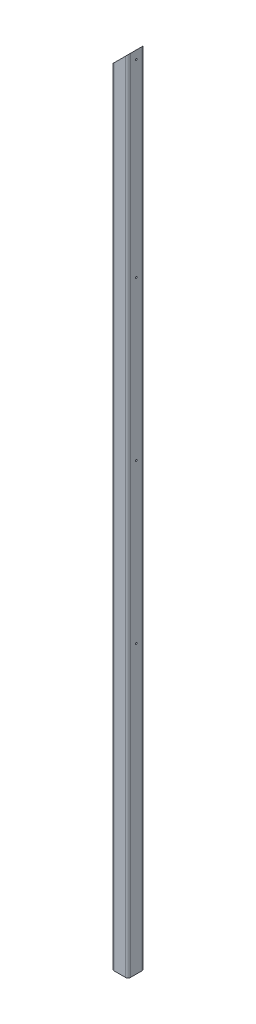
ISO-10303-21;
HEADER;
FILE_DESCRIPTION(('STEP AP214'),'2;1');
FILE_NAME('part.step','',(''),(''),'','','');
FILE_SCHEMA(('AUTOMOTIVE_DESIGN { 1 0 10303 214 1 1 1 1 }'));
ENDSEC;
DATA;
#1=APPLICATION_CONTEXT('core data for automotive mechanical design processes');
#2=APPLICATION_PROTOCOL_DEFINITION('international standard','automotive_design',2000,#1);
#3=PRODUCT_CONTEXT('',#1,'mechanical');
#4=PRODUCT('Part','Part','',(#3));
#5=PRODUCT_RELATED_PRODUCT_CATEGORY('part','',(#4));
#6=PRODUCT_DEFINITION_FORMATION('','',#4);
#7=PRODUCT_DEFINITION_CONTEXT('part definition',#1,'design');
#8=PRODUCT_DEFINITION('design','',#6,#7);
#9=PRODUCT_DEFINITION_SHAPE('','',#8);
#10=(LENGTH_UNIT() NAMED_UNIT(*) SI_UNIT(.MILLI.,.METRE.));
#11=(NAMED_UNIT(*) PLANE_ANGLE_UNIT() SI_UNIT($,.RADIAN.));
#12=(NAMED_UNIT(*) SI_UNIT($,.STERADIAN.) SOLID_ANGLE_UNIT());
#13=UNCERTAINTY_MEASURE_WITH_UNIT(LENGTH_MEASURE(1.E-05),#10,'distance_accuracy_value','');
#14=(GEOMETRIC_REPRESENTATION_CONTEXT(3) GLOBAL_UNCERTAINTY_ASSIGNED_CONTEXT((#13)) GLOBAL_UNIT_ASSIGNED_CONTEXT((#10,
#11,#12)) REPRESENTATION_CONTEXT('',''));
#15=CARTESIAN_POINT('',(0.,0.,0.));
#16=DIRECTION('',(0.,0.,1.));
#17=DIRECTION('',(1.,0.,0.));
#18=AXIS2_PLACEMENT_3D('',#15,#16,#17);
#19=CARTESIAN_POINT('',(-13.6,1920.,13.6));
#20=DIRECTION('',(0.,-1.,0.));
#21=DIRECTION('',(0.,0.,-1.));
#22=AXIS2_PLACEMENT_3D('',#19,#20,#21);
#23=CYLINDRICAL_SURFACE('',#22,6.4);
#24=CARTESIAN_POINT('',(-13.6,1886.4,13.6));
#25=DIRECTION('',(-0.707106781186548,0.707106781186547,0.));
#26=DIRECTION('',(-0.707106781186547,-0.707106781186548,0.));
#27=AXIS2_PLACEMENT_3D('',#24,#25,#26);
#28=ELLIPSE('',#27,9.05096679918782,6.4);
#29=CARTESIAN_POINT('',(-20.,1880.,13.6));
#30=VERTEX_POINT('',#29);
#31=CARTESIAN_POINT('',(-13.5999999999999,1886.4,20.));
#32=VERTEX_POINT('',#31);
#33=EDGE_CURVE('E245',#30,#32,#28,.T.);
#34=ORIENTED_EDGE('',*,*,#33,.F.);
#35=DIRECTION('',(0.,-1.,0.));
#36=VECTOR('',#35,1.);
#37=CARTESIAN_POINT('',(-20.,1920.,13.6));
#38=LINE('',#37,#36);
#39=CARTESIAN_POINT('',(-20.,0.,13.6));
#40=VERTEX_POINT('',#39);
#41=EDGE_CURVE('E161',#30,#40,#38,.T.);
#42=ORIENTED_EDGE('',*,*,#41,.T.);
#43=CARTESIAN_POINT('',(-13.6,0.,13.6));
#44=DIRECTION('',(0.,1.,0.));
#45=DIRECTION('',(0.,0.,1.));
#46=AXIS2_PLACEMENT_3D('',#43,#44,#45);
#47=CIRCLE('',#46,6.4);
#48=CARTESIAN_POINT('',(-13.6,0.,20.));
#49=VERTEX_POINT('',#48);
#50=EDGE_CURVE('E176',#40,#49,#47,.T.);
#51=ORIENTED_EDGE('',*,*,#50,.T.);
#52=DIRECTION('',(0.,-1.,0.));
#53=VECTOR('',#52,1.);
#54=CARTESIAN_POINT('',(-13.6,1920.,20.));
#55=LINE('',#54,#53);
#56=EDGE_CURVE('E12',#32,#49,#55,.T.);
#57=ORIENTED_EDGE('',*,*,#56,.F.);
#58=EDGE_LOOP('',(#34,#42,#51,#57));
#59=FACE_BOUND('',#58,.T.);
#60=ADVANCED_FACE('F66',(#59),#23,.T.);
#61=CARTESIAN_POINT('',(-13.6,1920.,20.));
#62=DIRECTION('',(0.,0.,-1.));
#63=DIRECTION('',(-1.,0.,0.));
#64=AXIS2_PLACEMENT_3D('',#61,#62,#63);
#65=PLANE('',#64);
#66=DIRECTION('',(0.707106781186547,0.707106781186548,0.));
#67=VECTOR('',#66,1.);
#68=CARTESIAN_POINT('',(-950.,950.,20.));
#69=LINE('',#68,#67);
#70=CARTESIAN_POINT('',(13.6,1913.6,20.));
#71=VERTEX_POINT('',#70);
#72=EDGE_CURVE('E350',#32,#71,#69,.T.);
#73=ORIENTED_EDGE('',*,*,#72,.F.);
#74=ORIENTED_EDGE('',*,*,#56,.T.);
#75=DIRECTION('',(1.,0.,0.));
#76=VECTOR('',#75,1.);
#77=CARTESIAN_POINT('',(-13.6,0.,20.));
#78=LINE('',#77,#76);
#79=CARTESIAN_POINT('',(13.6,0.,20.));
#80=VERTEX_POINT('',#79);
#81=EDGE_CURVE('E274',#49,#80,#78,.T.);
#82=ORIENTED_EDGE('',*,*,#81,.T.);
#83=DIRECTION('',(0.,-1.,0.));
#84=VECTOR('',#83,1.);
#85=CARTESIAN_POINT('',(13.6,1920.,20.));
#86=LINE('',#85,#84);
#87=EDGE_CURVE('E76',#71,#80,#86,.T.);
#88=ORIENTED_EDGE('',*,*,#87,.F.);
#89=EDGE_LOOP('',(#73,#74,#82,#88));
#90=FACE_BOUND('',#89,.T.);
#91=ADVANCED_FACE('F356',(#90),#65,.F.);
#92=CARTESIAN_POINT('',(13.6,1920.,13.6));
#93=DIRECTION('',(0.,-1.,0.));
#94=DIRECTION('',(0.,0.,-1.));
#95=AXIS2_PLACEMENT_3D('',#92,#93,#94);
#96=CYLINDRICAL_SURFACE('',#95,6.4);
#97=CARTESIAN_POINT('',(13.6,1913.6,13.6));
#98=DIRECTION('',(-0.707106781186548,0.707106781186547,0.));
#99=DIRECTION('',(-0.707106781186547,-0.707106781186548,0.));
#100=AXIS2_PLACEMENT_3D('',#97,#98,#99);
#101=ELLIPSE('',#100,9.05096679918782,6.4);
#102=CARTESIAN_POINT('',(20.,1920.,13.6));
#103=VERTEX_POINT('',#102);
#104=EDGE_CURVE('E93',#71,#103,#101,.T.);
#105=ORIENTED_EDGE('',*,*,#104,.F.);
#106=ORIENTED_EDGE('',*,*,#87,.T.);
#107=CARTESIAN_POINT('',(13.6,0.,13.6));
#108=DIRECTION('',(0.,1.,0.));
#109=DIRECTION('',(0.,0.,1.));
#110=AXIS2_PLACEMENT_3D('',#107,#108,#109);
#111=CIRCLE('',#110,6.4);
#112=CARTESIAN_POINT('',(20.,0.,13.6));
#113=VERTEX_POINT('',#112);
#114=EDGE_CURVE('E278',#80,#113,#111,.T.);
#115=ORIENTED_EDGE('',*,*,#114,.T.);
#116=DIRECTION('',(0.,-1.,0.));
#117=VECTOR('',#116,1.);
#118=CARTESIAN_POINT('',(20.,1920.,13.6));
#119=LINE('',#118,#117);
#120=EDGE_CURVE('E196',#103,#113,#119,.T.);
#121=ORIENTED_EDGE('',*,*,#120,.F.);
#122=EDGE_LOOP('',(#105,#106,#115,#121));
#123=FACE_BOUND('',#122,.T.);
#124=ADVANCED_FACE('F424',(#123),#96,.T.);
#125=CARTESIAN_POINT('',(13.6,1920.,-13.6));
#126=DIRECTION('',(0.,-1.,0.));
#127=DIRECTION('',(0.,0.,-1.));
#128=AXIS2_PLACEMENT_3D('',#125,#126,#127);
#129=CYLINDRICAL_SURFACE('',#128,6.4);
#130=CARTESIAN_POINT('',(13.6,1913.6,-13.6));
#131=DIRECTION('',(-0.707106781186548,0.707106781186547,0.));
#132=DIRECTION('',(-0.707106781186547,-0.707106781186548,0.));
#133=AXIS2_PLACEMENT_3D('',#130,#131,#132);
#134=ELLIPSE('',#133,9.05096679918781,6.4);
#135=CARTESIAN_POINT('',(20.,1920.,-13.6));
#136=VERTEX_POINT('',#135);
#137=CARTESIAN_POINT('',(13.6000000000003,1913.6,-20.));
#138=VERTEX_POINT('',#137);
#139=EDGE_CURVE('E303',#136,#138,#134,.T.);
#140=ORIENTED_EDGE('',*,*,#139,.F.);
#141=DIRECTION('',(0.,-1.,0.));
#142=VECTOR('',#141,1.);
#143=CARTESIAN_POINT('',(20.,1920.,-13.6));
#144=LINE('',#143,#142);
#145=CARTESIAN_POINT('',(20.,0.,-13.6));
#146=VERTEX_POINT('',#145);
#147=EDGE_CURVE('E192',#136,#146,#144,.T.);
#148=ORIENTED_EDGE('',*,*,#147,.T.);
#149=CARTESIAN_POINT('',(13.6,0.,-13.6));
#150=DIRECTION('',(0.,1.,0.));
#151=DIRECTION('',(0.,0.,1.));
#152=AXIS2_PLACEMENT_3D('',#149,#150,#151);
#153=CIRCLE('',#152,6.4);
#154=CARTESIAN_POINT('',(13.6,0.,-20.));
#155=VERTEX_POINT('',#154);
#156=EDGE_CURVE('E284',#146,#155,#153,.T.);
#157=ORIENTED_EDGE('',*,*,#156,.T.);
#158=DIRECTION('',(0.,-1.,0.));
#159=VECTOR('',#158,1.);
#160=CARTESIAN_POINT('',(13.6,1920.,-20.));
#161=LINE('',#160,#159);
#162=EDGE_CURVE('E189',#138,#155,#161,.T.);
#163=ORIENTED_EDGE('',*,*,#162,.F.);
#164=EDGE_LOOP('',(#140,#148,#157,#163));
#165=FACE_BOUND('',#164,.T.);
#166=ADVANCED_FACE('F298',(#165),#129,.T.);
#167=CARTESIAN_POINT('',(13.6,1920.,-20.));
#168=DIRECTION('',(0.,0.,1.));
#169=DIRECTION('',(1.,0.,0.));
#170=AXIS2_PLACEMENT_3D('',#167,#168,#169);
#171=PLANE('',#170);
#172=CARTESIAN_POINT('',(0.,687.,-20.));
#173=DIRECTION('',(0.,0.,-1.));
#174=DIRECTION('',(-1.,0.,0.));
#175=AXIS2_PLACEMENT_3D('',#172,#173,#174);
#176=CIRCLE('',#175,2.);
#177=CARTESIAN_POINT('',(-2.,687.,-20.));
#178=VERTEX_POINT('',#177);
#179=EDGE_CURVE('E490',#178,#178,#176,.T.);
#180=ORIENTED_EDGE('',*,*,#179,.F.);
#181=EDGE_LOOP('',(#180));
#182=FACE_BOUND('',#181,.T.);
#183=DIRECTION('',(0.707106781186547,0.707106781186548,0.));
#184=VECTOR('',#183,1.);
#185=CARTESIAN_POINT('',(-950.,950.,-20.));
#186=LINE('',#185,#184);
#187=CARTESIAN_POINT('',(-13.6,1886.4,-20.));
#188=VERTEX_POINT('',#187);
#189=EDGE_CURVE('E358',#188,#138,#186,.T.);
#190=ORIENTED_EDGE('',*,*,#189,.T.);
#191=ORIENTED_EDGE('',*,*,#162,.T.);
#192=DIRECTION('',(-1.,0.,0.));
#193=VECTOR('',#192,1.);
#194=CARTESIAN_POINT('',(13.6,0.,-20.));
#195=LINE('',#194,#193);
#196=CARTESIAN_POINT('',(-13.6,0.,-20.));
#197=VERTEX_POINT('',#196);
#198=EDGE_CURVE('E171',#155,#197,#195,.T.);
#199=ORIENTED_EDGE('',*,*,#198,.T.);
#200=DIRECTION('',(0.,-1.,0.));
#201=VECTOR('',#200,1.);
#202=CARTESIAN_POINT('',(-13.6,1920.,-20.));
#203=LINE('',#202,#201);
#204=EDGE_CURVE('E160',#188,#197,#203,.T.);
#205=ORIENTED_EDGE('',*,*,#204,.F.);
#206=EDGE_LOOP('',(#190,#191,#199,#205));
#207=FACE_BOUND('',#206,.T.);
#208=ADVANCED_FACE('F290',(#182,#207),#171,.F.);
#209=CARTESIAN_POINT('',(-13.6,1920.,-13.6));
#210=DIRECTION('',(0.,-1.,0.));
#211=DIRECTION('',(0.,0.,-1.));
#212=AXIS2_PLACEMENT_3D('',#209,#210,#211);
#213=CYLINDRICAL_SURFACE('',#212,6.4);
#214=CARTESIAN_POINT('',(-13.6,1886.4,-13.6));
#215=DIRECTION('',(-0.707106781186548,0.707106781186547,0.));
#216=DIRECTION('',(-0.707106781186547,-0.707106781186548,0.));
#217=AXIS2_PLACEMENT_3D('',#214,#215,#216);
#218=ELLIPSE('',#217,9.05096679918782,6.4);
#219=CARTESIAN_POINT('',(-20.,1880.,-13.6));
#220=VERTEX_POINT('',#219);
#221=EDGE_CURVE('E331',#188,#220,#218,.T.);
#222=ORIENTED_EDGE('',*,*,#221,.F.);
#223=ORIENTED_EDGE('',*,*,#204,.T.);
#224=CARTESIAN_POINT('',(-13.6,0.,-13.6));
#225=DIRECTION('',(0.,1.,0.));
#226=DIRECTION('',(0.,0.,1.));
#227=AXIS2_PLACEMENT_3D('',#224,#225,#226);
#228=CIRCLE('',#227,6.4);
#229=CARTESIAN_POINT('',(-20.,0.,-13.6));
#230=VERTEX_POINT('',#229);
#231=EDGE_CURVE('E164',#197,#230,#228,.T.);
#232=ORIENTED_EDGE('',*,*,#231,.T.);
#233=DIRECTION('',(0.,-1.,0.));
#234=VECTOR('',#233,1.);
#235=CARTESIAN_POINT('',(-20.,1920.,-13.6));
#236=LINE('',#235,#234);
#237=EDGE_CURVE('E147',#220,#230,#236,.T.);
#238=ORIENTED_EDGE('',*,*,#237,.F.);
#239=EDGE_LOOP('',(#222,#223,#232,#238));
#240=FACE_BOUND('',#239,.T.);
#241=ADVANCED_FACE('F165',(#240),#213,.T.);
#242=CARTESIAN_POINT('',(13.6,1920.,13.6));
#243=DIRECTION('',(0.,-1.,0.));
#244=DIRECTION('',(0.,0.,-1.));
#245=AXIS2_PLACEMENT_3D('',#242,#243,#244);
#246=CYLINDRICAL_SURFACE('',#245,3.2);
#247=DIRECTION('',(0.,-1.,0.));
#248=VECTOR('',#247,1.);
#249=CARTESIAN_POINT('',(13.6,1920.,16.8));
#250=LINE('',#249,#248);
#251=CARTESIAN_POINT('',(13.6,1913.6,16.8));
#252=VERTEX_POINT('',#251);
#253=CARTESIAN_POINT('',(13.6,0.,16.8));
#254=VERTEX_POINT('',#253);
#255=EDGE_CURVE('E70',#252,#254,#250,.T.);
#256=ORIENTED_EDGE('',*,*,#255,.F.);
#257=CARTESIAN_POINT('',(13.6,1913.6,13.6));
#258=DIRECTION('',(-0.707106781186548,0.707106781186547,0.));
#259=DIRECTION('',(-0.707106781186547,-0.707106781186548,0.));
#260=AXIS2_PLACEMENT_3D('',#257,#258,#259);
#261=ELLIPSE('',#260,4.52548339959391,3.2);
#262=CARTESIAN_POINT('',(16.8,1916.8,13.6));
#263=VERTEX_POINT('',#262);
#264=EDGE_CURVE('E327',#252,#263,#261,.T.);
#265=ORIENTED_EDGE('',*,*,#264,.T.);
#266=DIRECTION('',(0.,-1.,0.));
#267=VECTOR('',#266,1.);
#268=CARTESIAN_POINT('',(16.8,1920.,13.6));
#269=LINE('',#268,#267);
#270=CARTESIAN_POINT('',(16.8,0.,13.6));
#271=VERTEX_POINT('',#270);
#272=EDGE_CURVE('E181',#263,#271,#269,.T.);
#273=ORIENTED_EDGE('',*,*,#272,.T.);
#274=CARTESIAN_POINT('',(13.6,0.,13.6));
#275=DIRECTION('',(0.,1.,0.));
#276=DIRECTION('',(0.,0.,1.));
#277=AXIS2_PLACEMENT_3D('',#274,#275,#276);
#278=CIRCLE('',#277,3.2);
#279=EDGE_CURVE('E239',#254,#271,#278,.T.);
#280=ORIENTED_EDGE('',*,*,#279,.F.);
#281=EDGE_LOOP('',(#256,#265,#273,#280));
#282=FACE_BOUND('',#281,.T.);
#283=ADVANCED_FACE('F68',(#282),#246,.F.);
#284=CARTESIAN_POINT('',(-13.6,1920.,16.8));
#285=DIRECTION('',(0.,0.,-1.));
#286=DIRECTION('',(-1.,0.,0.));
#287=AXIS2_PLACEMENT_3D('',#284,#285,#286);
#288=PLANE('',#287);
#289=DIRECTION('',(0.,-1.,0.));
#290=VECTOR('',#289,1.);
#291=CARTESIAN_POINT('',(-13.6,1920.,16.8));
#292=LINE('',#291,#290);
#293=CARTESIAN_POINT('',(-13.6,1886.4,16.8));
#294=VERTEX_POINT('',#293);
#295=CARTESIAN_POINT('',(-13.6,0.,16.8));
#296=VERTEX_POINT('',#295);
#297=EDGE_CURVE('E218',#294,#296,#292,.T.);
#298=ORIENTED_EDGE('',*,*,#297,.F.);
#299=DIRECTION('',(0.707106781186547,0.707106781186548,0.));
#300=VECTOR('',#299,1.);
#301=CARTESIAN_POINT('',(3.19999999999985,1903.2,16.8));
#302=LINE('',#301,#300);
#303=EDGE_CURVE('E235',#294,#252,#302,.T.);
#304=ORIENTED_EDGE('',*,*,#303,.T.);
#305=ORIENTED_EDGE('',*,*,#255,.T.);
#306=DIRECTION('',(1.,0.,0.));
#307=VECTOR('',#306,1.);
#308=CARTESIAN_POINT('',(-13.6,0.,16.8));
#309=LINE('',#308,#307);
#310=EDGE_CURVE('E232',#296,#254,#309,.T.);
#311=ORIENTED_EDGE('',*,*,#310,.F.);
#312=EDGE_LOOP('',(#298,#304,#305,#311));
#313=FACE_BOUND('',#312,.T.);
#314=ADVANCED_FACE('F230',(#313),#288,.T.);
#315=CARTESIAN_POINT('',(-13.6,1920.,13.6));
#316=DIRECTION('',(0.,-1.,0.));
#317=DIRECTION('',(0.,0.,-1.));
#318=AXIS2_PLACEMENT_3D('',#315,#316,#317);
#319=CYLINDRICAL_SURFACE('',#318,3.2);
#320=DIRECTION('',(0.,-1.,0.));
#321=VECTOR('',#320,1.);
#322=CARTESIAN_POINT('',(-16.8,1920.,13.6));
#323=LINE('',#322,#321);
#324=CARTESIAN_POINT('',(-16.8,1883.2,13.6));
#325=VERTEX_POINT('',#324);
#326=CARTESIAN_POINT('',(-16.8,0.,13.6));
#327=VERTEX_POINT('',#326);
#328=EDGE_CURVE('E216',#325,#327,#323,.T.);
#329=ORIENTED_EDGE('',*,*,#328,.F.);
#330=CARTESIAN_POINT('',(-13.6,1886.4,13.6));
#331=DIRECTION('',(-0.707106781186548,0.707106781186547,0.));
#332=DIRECTION('',(-0.707106781186547,-0.707106781186548,0.));
#333=AXIS2_PLACEMENT_3D('',#330,#331,#332);
#334=ELLIPSE('',#333,4.5254833995939,3.2);
#335=EDGE_CURVE('E336',#325,#294,#334,.T.);
#336=ORIENTED_EDGE('',*,*,#335,.T.);
#337=ORIENTED_EDGE('',*,*,#297,.T.);
#338=CARTESIAN_POINT('',(-13.6,0.,13.6));
#339=DIRECTION('',(0.,1.,0.));
#340=DIRECTION('',(0.,0.,1.));
#341=AXIS2_PLACEMENT_3D('',#338,#339,#340);
#342=CIRCLE('',#341,3.2);
#343=EDGE_CURVE('E248',#327,#296,#342,.T.);
#344=ORIENTED_EDGE('',*,*,#343,.F.);
#345=EDGE_LOOP('',(#329,#336,#337,#344));
#346=FACE_BOUND('',#345,.T.);
#347=ADVANCED_FACE('F392',(#346),#319,.F.);
#348=CARTESIAN_POINT('',(-16.8,1920.,13.6));
#349=DIRECTION('',(1.,0.,0.));
#350=DIRECTION('',(0.,0.,-1.));
#351=AXIS2_PLACEMENT_3D('',#348,#349,#350);
#352=PLANE('',#351);
#353=DIRECTION('',(0.,-1.,0.));
#354=VECTOR('',#353,1.);
#355=CARTESIAN_POINT('',(-16.8,1920.,-13.6));
#356=LINE('',#355,#354);
#357=CARTESIAN_POINT('',(-16.8,1883.2,-13.6));
#358=VERTEX_POINT('',#357);
#359=CARTESIAN_POINT('',(-16.8,0.,-13.6));
#360=VERTEX_POINT('',#359);
#361=EDGE_CURVE('E213',#358,#360,#356,.T.);
#362=ORIENTED_EDGE('',*,*,#361,.F.);
#363=DIRECTION('',(0.,0.,1.));
#364=VECTOR('',#363,1.);
#365=CARTESIAN_POINT('',(-16.8,1883.2,13.6));
#366=LINE('',#365,#364);
#367=EDGE_CURVE('E387',#358,#325,#366,.T.);
#368=ORIENTED_EDGE('',*,*,#367,.T.);
#369=ORIENTED_EDGE('',*,*,#328,.T.);
#370=DIRECTION('',(0.,0.,1.));
#371=VECTOR('',#370,1.);
#372=CARTESIAN_POINT('',(-16.8,0.,13.6));
#373=LINE('',#372,#371);
#374=EDGE_CURVE('E252',#360,#327,#373,.T.);
#375=ORIENTED_EDGE('',*,*,#374,.F.);
#376=EDGE_LOOP('',(#362,#368,#369,#375));
#377=FACE_BOUND('',#376,.T.);
#378=ADVANCED_FACE('F395',(#377),#352,.T.);
#379=CARTESIAN_POINT('',(-13.6,1920.,-13.6));
#380=DIRECTION('',(0.,-1.,0.));
#381=DIRECTION('',(0.,0.,-1.));
#382=AXIS2_PLACEMENT_3D('',#379,#380,#381);
#383=CYLINDRICAL_SURFACE('',#382,3.2);
#384=DIRECTION('',(0.,-1.,0.));
#385=VECTOR('',#384,1.);
#386=CARTESIAN_POINT('',(-13.6,1920.,-16.8));
#387=LINE('',#386,#385);
#388=CARTESIAN_POINT('',(-13.6,1886.4,-16.8));
#389=VERTEX_POINT('',#388);
#390=CARTESIAN_POINT('',(-13.6,0.,-16.8));
#391=VERTEX_POINT('',#390);
#392=EDGE_CURVE('E210',#389,#391,#387,.T.);
#393=ORIENTED_EDGE('',*,*,#392,.F.);
#394=CARTESIAN_POINT('',(-13.6,1886.4,-13.6));
#395=DIRECTION('',(-0.707106781186548,0.707106781186547,0.));
#396=DIRECTION('',(-0.707106781186547,-0.707106781186548,0.));
#397=AXIS2_PLACEMENT_3D('',#394,#395,#396);
#398=ELLIPSE('',#397,4.5254833995939,3.2);
#399=EDGE_CURVE('E383',#389,#358,#398,.T.);
#400=ORIENTED_EDGE('',*,*,#399,.T.);
#401=ORIENTED_EDGE('',*,*,#361,.T.);
#402=CARTESIAN_POINT('',(-13.6,0.,-13.6));
#403=DIRECTION('',(0.,1.,0.));
#404=DIRECTION('',(0.,0.,1.));
#405=AXIS2_PLACEMENT_3D('',#402,#403,#404);
#406=CIRCLE('',#405,3.2);
#407=EDGE_CURVE('E257',#391,#360,#406,.T.);
#408=ORIENTED_EDGE('',*,*,#407,.F.);
#409=EDGE_LOOP('',(#393,#400,#401,#408));
#410=FACE_BOUND('',#409,.T.);
#411=ADVANCED_FACE('F400',(#410),#383,.F.);
#412=CARTESIAN_POINT('',(13.6,1920.,-16.8));
#413=DIRECTION('',(0.,0.,1.));
#414=DIRECTION('',(1.,0.,0.));
#415=AXIS2_PLACEMENT_3D('',#412,#413,#414);
#416=PLANE('',#415);
#417=DIRECTION('',(0.,-1.,0.));
#418=VECTOR('',#417,1.);
#419=CARTESIAN_POINT('',(13.6,1920.,-16.8));
#420=LINE('',#419,#418);
#421=CARTESIAN_POINT('',(13.6,1913.6,-16.8));
#422=VERTEX_POINT('',#421);
#423=CARTESIAN_POINT('',(13.6,0.,-16.8));
#424=VERTEX_POINT('',#423);
#425=EDGE_CURVE('E207',#422,#424,#420,.T.);
#426=ORIENTED_EDGE('',*,*,#425,.F.);
#427=DIRECTION('',(-0.707106781186547,-0.707106781186548,0.));
#428=VECTOR('',#427,1.);
#429=CARTESIAN_POINT('',(16.7999999999999,1916.8,-16.8));
#430=LINE('',#429,#428);
#431=EDGE_CURVE('E379',#422,#389,#430,.T.);
#432=ORIENTED_EDGE('',*,*,#431,.T.);
#433=ORIENTED_EDGE('',*,*,#392,.T.);
#434=DIRECTION('',(-1.,0.,0.));
#435=VECTOR('',#434,1.);
#436=CARTESIAN_POINT('',(13.6,0.,-16.8));
#437=LINE('',#436,#435);
#438=EDGE_CURVE('E261',#424,#391,#437,.T.);
#439=ORIENTED_EDGE('',*,*,#438,.F.);
#440=EDGE_LOOP('',(#426,#432,#433,#439));
#441=FACE_BOUND('',#440,.T.);
#442=ADVANCED_FACE('F403',(#441),#416,.T.);
#443=CARTESIAN_POINT('',(13.6,1920.,-13.6));
#444=DIRECTION('',(0.,-1.,0.));
#445=DIRECTION('',(0.,0.,-1.));
#446=AXIS2_PLACEMENT_3D('',#443,#444,#445);
#447=CYLINDRICAL_SURFACE('',#446,3.2);
#448=DIRECTION('',(0.,-1.,0.));
#449=VECTOR('',#448,1.);
#450=CARTESIAN_POINT('',(16.8,1920.,-13.6));
#451=LINE('',#450,#449);
#452=CARTESIAN_POINT('',(16.8,1916.8,-13.6));
#453=VERTEX_POINT('',#452);
#454=CARTESIAN_POINT('',(16.8,0.,-13.6));
#455=VERTEX_POINT('',#454);
#456=EDGE_CURVE('E204',#453,#455,#451,.T.);
#457=ORIENTED_EDGE('',*,*,#456,.F.);
#458=CARTESIAN_POINT('',(13.6,1913.6,-13.6));
#459=DIRECTION('',(-0.707106781186548,0.707106781186547,0.));
#460=DIRECTION('',(-0.707106781186547,-0.707106781186548,0.));
#461=AXIS2_PLACEMENT_3D('',#458,#459,#460);
#462=ELLIPSE('',#461,4.5254833995939,3.2);
#463=EDGE_CURVE('E84',#453,#422,#462,.T.);
#464=ORIENTED_EDGE('',*,*,#463,.T.);
#465=ORIENTED_EDGE('',*,*,#425,.T.);
#466=CARTESIAN_POINT('',(13.6,0.,-13.6));
#467=DIRECTION('',(0.,1.,0.));
#468=DIRECTION('',(0.,0.,1.));
#469=AXIS2_PLACEMENT_3D('',#466,#467,#468);
#470=CIRCLE('',#469,3.2);
#471=EDGE_CURVE('E265',#455,#424,#470,.T.);
#472=ORIENTED_EDGE('',*,*,#471,.F.);
#473=EDGE_LOOP('',(#457,#464,#465,#472));
#474=FACE_BOUND('',#473,.T.);
#475=ADVANCED_FACE('F408',(#474),#447,.F.);
#476=CARTESIAN_POINT('',(16.8,1920.,-13.6));
#477=DIRECTION('',(-1.,0.,0.));
#478=DIRECTION('',(0.,0.,1.));
#479=AXIS2_PLACEMENT_3D('',#476,#477,#478);
#480=PLANE('',#479);
#481=ORIENTED_EDGE('',*,*,#272,.F.);
#482=DIRECTION('',(0.,0.,-1.));
#483=VECTOR('',#482,1.);
#484=CARTESIAN_POINT('',(16.8,1916.8,-13.6));
#485=LINE('',#484,#483);
#486=EDGE_CURVE('E329',#263,#453,#485,.T.);
#487=ORIENTED_EDGE('',*,*,#486,.T.);
#488=ORIENTED_EDGE('',*,*,#456,.T.);
#489=DIRECTION('',(0.,0.,-1.));
#490=VECTOR('',#489,1.);
#491=CARTESIAN_POINT('',(16.8,0.,-13.6));
#492=LINE('',#491,#490);
#493=EDGE_CURVE('E269',#271,#455,#492,.T.);
#494=ORIENTED_EDGE('',*,*,#493,.F.);
#495=EDGE_LOOP('',(#481,#487,#488,#494));
#496=FACE_BOUND('',#495,.T.);
#497=ADVANCED_FACE('F410',(#496),#480,.T.);
#498=CARTESIAN_POINT('',(-20.,1920.,13.6));
#499=DIRECTION('',(1.,0.,0.));
#500=DIRECTION('',(0.,0.,-1.));
#501=AXIS2_PLACEMENT_3D('',#498,#499,#500);
#502=PLANE('',#501);
#503=DIRECTION('',(0.,0.,-1.));
#504=VECTOR('',#503,1.);
#505=CARTESIAN_POINT('',(-20.,1880.,20.));
#506=LINE('',#505,#504);
#507=EDGE_CURVE('E156',#30,#220,#506,.T.);
#508=ORIENTED_EDGE('',*,*,#507,.T.);
#509=ORIENTED_EDGE('',*,*,#237,.T.);
#510=DIRECTION('',(0.,0.,1.));
#511=VECTOR('',#510,1.);
#512=CARTESIAN_POINT('',(-20.,0.,13.6));
#513=LINE('',#512,#511);
#514=EDGE_CURVE('E152',#230,#40,#513,.T.);
#515=ORIENTED_EDGE('',*,*,#514,.T.);
#516=ORIENTED_EDGE('',*,*,#41,.F.);
#517=EDGE_LOOP('',(#508,#509,#515,#516));
#518=FACE_BOUND('',#517,.T.);
#519=ADVANCED_FACE('F149',(#518),#502,.F.);
#520=CARTESIAN_POINT('',(20.,1920.,-13.6));
#521=DIRECTION('',(-1.,0.,0.));
#522=DIRECTION('',(0.,0.,1.));
#523=AXIS2_PLACEMENT_3D('',#520,#521,#522);
#524=PLANE('',#523);
#525=CARTESIAN_POINT('',(20.,1900.,0.));
#526=DIRECTION('',(1.,0.,0.));
#527=DIRECTION('',(0.,0.,-1.));
#528=AXIS2_PLACEMENT_3D('',#525,#526,#527);
#529=CIRCLE('',#528,2.);
#530=CARTESIAN_POINT('',(20.,1900.,-2.00000000000001));
#531=VERTEX_POINT('',#530);
#532=EDGE_CURVE('E369',#531,#531,#529,.T.);
#533=ORIENTED_EDGE('',*,*,#532,.F.);
#534=EDGE_LOOP('',(#533));
#535=FACE_BOUND('',#534,.T.);
#536=CARTESIAN_POINT('',(20.,1447.,0.));
#537=DIRECTION('',(1.,0.,0.));
#538=DIRECTION('',(0.,0.,-1.));
#539=AXIS2_PLACEMENT_3D('',#536,#537,#538);
#540=CIRCLE('',#539,2.);
#541=CARTESIAN_POINT('',(20.,1447.,-2.00000000000007));
#542=VERTEX_POINT('',#541);
#543=EDGE_CURVE('E506',#542,#542,#540,.T.);
#544=ORIENTED_EDGE('',*,*,#543,.F.);
#545=EDGE_LOOP('',(#544));
#546=FACE_BOUND('',#545,.T.);
#547=CARTESIAN_POINT('',(20.,1067.,-1.10920259905105E-13));
#548=DIRECTION('',(1.,0.,0.));
#549=DIRECTION('',(0.,0.,-1.));
#550=AXIS2_PLACEMENT_3D('',#547,#548,#549);
#551=CIRCLE('',#550,2.);
#552=CARTESIAN_POINT('',(20.,1067.,-2.00000000000011));
#553=VERTEX_POINT('',#552);
#554=EDGE_CURVE('E514',#553,#553,#551,.T.);
#555=ORIENTED_EDGE('',*,*,#554,.F.);
#556=EDGE_LOOP('',(#555));
#557=FACE_BOUND('',#556,.T.);
#558=CARTESIAN_POINT('',(20.,687.,-1.57757793756479E-13));
#559=DIRECTION('',(1.,0.,0.));
#560=DIRECTION('',(0.,0.,-1.));
#561=AXIS2_PLACEMENT_3D('',#558,#559,#560);
#562=CIRCLE('',#561,2.);
#563=CARTESIAN_POINT('',(20.,687.,-2.00000000000016));
#564=VERTEX_POINT('',#563);
#565=EDGE_CURVE('E489',#564,#564,#562,.T.);
#566=ORIENTED_EDGE('',*,*,#565,.F.);
#567=EDGE_LOOP('',(#566));
#568=FACE_BOUND('',#567,.T.);
#569=DIRECTION('',(0.,0.,-1.));
#570=VECTOR('',#569,1.);
#571=CARTESIAN_POINT('',(20.,0.,-13.6));
#572=LINE('',#571,#570);
#573=EDGE_CURVE('E281',#113,#146,#572,.T.);
#574=ORIENTED_EDGE('',*,*,#573,.T.);
#575=ORIENTED_EDGE('',*,*,#147,.F.);
#576=DIRECTION('',(0.,0.,-1.));
#577=VECTOR('',#576,1.);
#578=CARTESIAN_POINT('',(20.,1920.,-13.6));
#579=LINE('',#578,#577);
#580=EDGE_CURVE('E178',#103,#136,#579,.T.);
#581=ORIENTED_EDGE('',*,*,#580,.F.);
#582=ORIENTED_EDGE('',*,*,#120,.T.);
#583=EDGE_LOOP('',(#574,#575,#581,#582));
#584=FACE_BOUND('',#583,.T.);
#585=ADVANCED_FACE('F306',(#535,#546,#557,#568,#584),#524,.F.);
#586=CARTESIAN_POINT('',(-13.6,0.,13.6));
#587=DIRECTION('',(0.,1.,0.));
#588=DIRECTION('',(0.,0.,1.));
#589=AXIS2_PLACEMENT_3D('',#586,#587,#588);
#590=PLANE('',#589);
#591=ORIENTED_EDGE('',*,*,#279,.T.);
#592=ORIENTED_EDGE('',*,*,#493,.T.);
#593=ORIENTED_EDGE('',*,*,#471,.T.);
#594=ORIENTED_EDGE('',*,*,#438,.T.);
#595=ORIENTED_EDGE('',*,*,#407,.T.);
#596=ORIENTED_EDGE('',*,*,#374,.T.);
#597=ORIENTED_EDGE('',*,*,#343,.T.);
#598=ORIENTED_EDGE('',*,*,#310,.T.);
#599=EDGE_LOOP('',(#591,#592,#593,#594,#595,#596,#597,#598));
#600=FACE_BOUND('',#599,.T.);
#601=ORIENTED_EDGE('',*,*,#50,.F.);
#602=ORIENTED_EDGE('',*,*,#514,.F.);
#603=ORIENTED_EDGE('',*,*,#231,.F.);
#604=ORIENTED_EDGE('',*,*,#198,.F.);
#605=ORIENTED_EDGE('',*,*,#156,.F.);
#606=ORIENTED_EDGE('',*,*,#573,.F.);
#607=ORIENTED_EDGE('',*,*,#114,.F.);
#608=ORIENTED_EDGE('',*,*,#81,.F.);
#609=EDGE_LOOP('',(#601,#602,#603,#604,#605,#606,#607,#608));
#610=FACE_BOUND('',#609,.T.);
#611=ADVANCED_FACE('F173',(#600,#610),#590,.F.);
#612=CARTESIAN_POINT('',(-950.,950.,20.));
#613=DIRECTION('',(-0.707106781186548,0.707106781186547,0.));
#614=DIRECTION('',(-0.707106781186547,-0.707106781186548,0.));
#615=AXIS2_PLACEMENT_3D('',#612,#613,#614);
#616=PLANE('',#615);
#617=ORIENTED_EDGE('',*,*,#303,.F.);
#618=ORIENTED_EDGE('',*,*,#335,.F.);
#619=ORIENTED_EDGE('',*,*,#367,.F.);
#620=ORIENTED_EDGE('',*,*,#399,.F.);
#621=ORIENTED_EDGE('',*,*,#431,.F.);
#622=ORIENTED_EDGE('',*,*,#463,.F.);
#623=ORIENTED_EDGE('',*,*,#486,.F.);
#624=ORIENTED_EDGE('',*,*,#264,.F.);
#625=EDGE_LOOP('',(#617,#618,#619,#620,#621,#622,#623,#624));
#626=FACE_BOUND('',#625,.T.);
#627=ORIENTED_EDGE('',*,*,#33,.T.);
#628=ORIENTED_EDGE('',*,*,#72,.T.);
#629=ORIENTED_EDGE('',*,*,#104,.T.);
#630=ORIENTED_EDGE('',*,*,#580,.T.);
#631=ORIENTED_EDGE('',*,*,#139,.T.);
#632=ORIENTED_EDGE('',*,*,#189,.F.);
#633=ORIENTED_EDGE('',*,*,#221,.T.);
#634=ORIENTED_EDGE('',*,*,#507,.F.);
#635=EDGE_LOOP('',(#627,#628,#629,#630,#631,#632,#633,#634));
#636=FACE_BOUND('',#635,.T.);
#637=ADVANCED_FACE('F328',(#626,#636),#616,.T.);
#638=CARTESIAN_POINT('',(17.,687.,-1.56992474575901E-13));
#639=DIRECTION('',(1.,0.,0.));
#640=DIRECTION('',(0.,0.,-1.));
#641=AXIS2_PLACEMENT_3D('',#638,#639,#640);
#642=CYLINDRICAL_SURFACE('',#641,2.);
#643=CARTESIAN_POINT('',(17.,687.,-1.56992474575901E-13));
#644=DIRECTION('',(1.,0.,0.));
#645=DIRECTION('',(0.,0.,-1.));
#646=AXIS2_PLACEMENT_3D('',#643,#644,#645);
#647=CIRCLE('',#646,2.);
#648=CARTESIAN_POINT('',(17.,687.,-2.00000000000016));
#649=VERTEX_POINT('',#648);
#650=EDGE_CURVE('E495',#649,#649,#647,.T.);
#651=ORIENTED_EDGE('',*,*,#650,.F.);
#652=EDGE_LOOP('',(#651));
#653=FACE_BOUND('',#652,.T.);
#654=ORIENTED_EDGE('',*,*,#565,.T.);
#655=EDGE_LOOP('',(#654));
#656=FACE_BOUND('',#655,.T.);
#657=ADVANCED_FACE('F444',(#653,#656),#642,.F.);
#658=CARTESIAN_POINT('',(17.,687.,-1.56992474575901E-13));
#659=DIRECTION('',(1.,0.,0.));
#660=DIRECTION('',(0.,0.,-1.));
#661=AXIS2_PLACEMENT_3D('',#658,#659,#660);
#662=PLANE('',#661);
#663=ORIENTED_EDGE('',*,*,#650,.T.);
#664=EDGE_LOOP('',(#663));
#665=FACE_BOUND('',#664,.T.);
#666=ADVANCED_FACE('F447',(#665),#662,.T.);
#667=CARTESIAN_POINT('',(17.,1067.,-1.10154940724527E-13));
#668=DIRECTION('',(1.,0.,0.));
#669=DIRECTION('',(0.,0.,-1.));
#670=AXIS2_PLACEMENT_3D('',#667,#668,#669);
#671=CYLINDRICAL_SURFACE('',#670,2.);
#672=CARTESIAN_POINT('',(17.,1067.,-1.10154940724527E-13));
#673=DIRECTION('',(1.,0.,0.));
#674=DIRECTION('',(0.,0.,-1.));
#675=AXIS2_PLACEMENT_3D('',#672,#673,#674);
#676=CIRCLE('',#675,2.);
#677=CARTESIAN_POINT('',(17.,1067.,-2.00000000000011));
#678=VERTEX_POINT('',#677);
#679=EDGE_CURVE('E510',#678,#678,#676,.T.);
#680=ORIENTED_EDGE('',*,*,#679,.F.);
#681=EDGE_LOOP('',(#680));
#682=FACE_BOUND('',#681,.T.);
#683=ORIENTED_EDGE('',*,*,#554,.T.);
#684=EDGE_LOOP('',(#683));
#685=FACE_BOUND('',#684,.T.);
#686=ADVANCED_FACE('F451',(#682,#685),#671,.F.);
#687=CARTESIAN_POINT('',(17.,1067.,-1.10154940724527E-13));
#688=DIRECTION('',(1.,0.,0.));
#689=DIRECTION('',(0.,0.,-1.));
#690=AXIS2_PLACEMENT_3D('',#687,#688,#689);
#691=PLANE('',#690);
#692=ORIENTED_EDGE('',*,*,#679,.T.);
#693=EDGE_LOOP('',(#692));
#694=FACE_BOUND('',#693,.T.);
#695=ADVANCED_FACE('F455',(#694),#691,.T.);
#696=CARTESIAN_POINT('',(17.,1447.,0.));
#697=DIRECTION('',(1.,0.,0.));
#698=DIRECTION('',(0.,0.,-1.));
#699=AXIS2_PLACEMENT_3D('',#696,#697,#698);
#700=CYLINDRICAL_SURFACE('',#699,2.);
#701=CARTESIAN_POINT('',(17.,1447.,0.));
#702=DIRECTION('',(1.,0.,0.));
#703=DIRECTION('',(0.,0.,-1.));
#704=AXIS2_PLACEMENT_3D('',#701,#702,#703);
#705=CIRCLE('',#704,2.);
#706=CARTESIAN_POINT('',(17.,1447.,-2.00000000000006));
#707=VERTEX_POINT('',#706);
#708=EDGE_CURVE('E502',#707,#707,#705,.T.);
#709=ORIENTED_EDGE('',*,*,#708,.F.);
#710=EDGE_LOOP('',(#709));
#711=FACE_BOUND('',#710,.T.);
#712=ORIENTED_EDGE('',*,*,#543,.T.);
#713=EDGE_LOOP('',(#712));
#714=FACE_BOUND('',#713,.T.);
#715=ADVANCED_FACE('F459',(#711,#714),#700,.F.);
#716=CARTESIAN_POINT('',(17.,1447.,0.));
#717=DIRECTION('',(1.,0.,0.));
#718=DIRECTION('',(0.,0.,-1.));
#719=AXIS2_PLACEMENT_3D('',#716,#717,#718);
#720=PLANE('',#719);
#721=ORIENTED_EDGE('',*,*,#708,.T.);
#722=EDGE_LOOP('',(#721));
#723=FACE_BOUND('',#722,.T.);
#724=ADVANCED_FACE('F463',(#723),#720,.T.);
#725=CARTESIAN_POINT('',(17.,1900.,0.));
#726=DIRECTION('',(1.,0.,0.));
#727=DIRECTION('',(0.,0.,-1.));
#728=AXIS2_PLACEMENT_3D('',#725,#726,#727);
#729=CYLINDRICAL_SURFACE('',#728,2.);
#730=CARTESIAN_POINT('',(17.,1900.,0.));
#731=DIRECTION('',(1.,0.,0.));
#732=DIRECTION('',(0.,0.,-1.));
#733=AXIS2_PLACEMENT_3D('',#730,#731,#732);
#734=CIRCLE('',#733,2.);
#735=CARTESIAN_POINT('',(17.,1900.,-2.00000000000001));
#736=VERTEX_POINT('',#735);
#737=EDGE_CURVE('E365',#736,#736,#734,.T.);
#738=ORIENTED_EDGE('',*,*,#737,.F.);
#739=EDGE_LOOP('',(#738));
#740=FACE_BOUND('',#739,.T.);
#741=ORIENTED_EDGE('',*,*,#532,.T.);
#742=EDGE_LOOP('',(#741));
#743=FACE_BOUND('',#742,.T.);
#744=ADVANCED_FACE('F467',(#740,#743),#729,.F.);
#745=CARTESIAN_POINT('',(17.,1900.,0.));
#746=DIRECTION('',(1.,0.,0.));
#747=DIRECTION('',(0.,0.,-1.));
#748=AXIS2_PLACEMENT_3D('',#745,#746,#747);
#749=PLANE('',#748);
#750=ORIENTED_EDGE('',*,*,#737,.T.);
#751=EDGE_LOOP('',(#750));
#752=FACE_BOUND('',#751,.T.);
#753=ADVANCED_FACE('F471',(#752),#749,.T.);
#754=CARTESIAN_POINT('',(0.,687.,-17.));
#755=DIRECTION('',(0.,0.,-1.));
#756=DIRECTION('',(-1.,0.,0.));
#757=AXIS2_PLACEMENT_3D('',#754,#755,#756);
#758=CYLINDRICAL_SURFACE('',#757,2.);
#759=CARTESIAN_POINT('',(0.,687.,-17.));
#760=DIRECTION('',(0.,0.,-1.));
#761=DIRECTION('',(-1.,0.,0.));
#762=AXIS2_PLACEMENT_3D('',#759,#760,#761);
#763=CIRCLE('',#762,2.);
#764=CARTESIAN_POINT('',(-2.,687.,-17.));
#765=VERTEX_POINT('',#764);
#766=EDGE_CURVE('E487',#765,#765,#763,.T.);
#767=ORIENTED_EDGE('',*,*,#766,.F.);
#768=EDGE_LOOP('',(#767));
#769=FACE_BOUND('',#768,.T.);
#770=ORIENTED_EDGE('',*,*,#179,.T.);
#771=EDGE_LOOP('',(#770));
#772=FACE_BOUND('',#771,.T.);
#773=ADVANCED_FACE('F475',(#769,#772),#758,.F.);
#774=CARTESIAN_POINT('',(0.,687.,-17.));
#775=DIRECTION('',(0.,0.,-1.));
#776=DIRECTION('',(-1.,0.,0.));
#777=AXIS2_PLACEMENT_3D('',#774,#775,#776);
#778=PLANE('',#777);
#779=ORIENTED_EDGE('',*,*,#766,.T.);
#780=EDGE_LOOP('',(#779));
#781=FACE_BOUND('',#780,.T.);
#782=ADVANCED_FACE('F479',(#781),#778,.T.);
#783=CLOSED_SHELL('',(#60,#91,#124,#166,#208,#241,#283,#314,#347,#378,#411,#442,#475,#497,#519,
#585,#611,#637,#657,#666,#686,#695,#715,#724,#744,#753,#773,#782));
#784=MANIFOLD_SOLID_BREP('B2',#783);
#785=ADVANCED_BREP_SHAPE_REPRESENTATION('',(#18,#784),#14);
#786=SHAPE_DEFINITION_REPRESENTATION(#9,#785);
ENDSEC;
END-ISO-10303-21;
